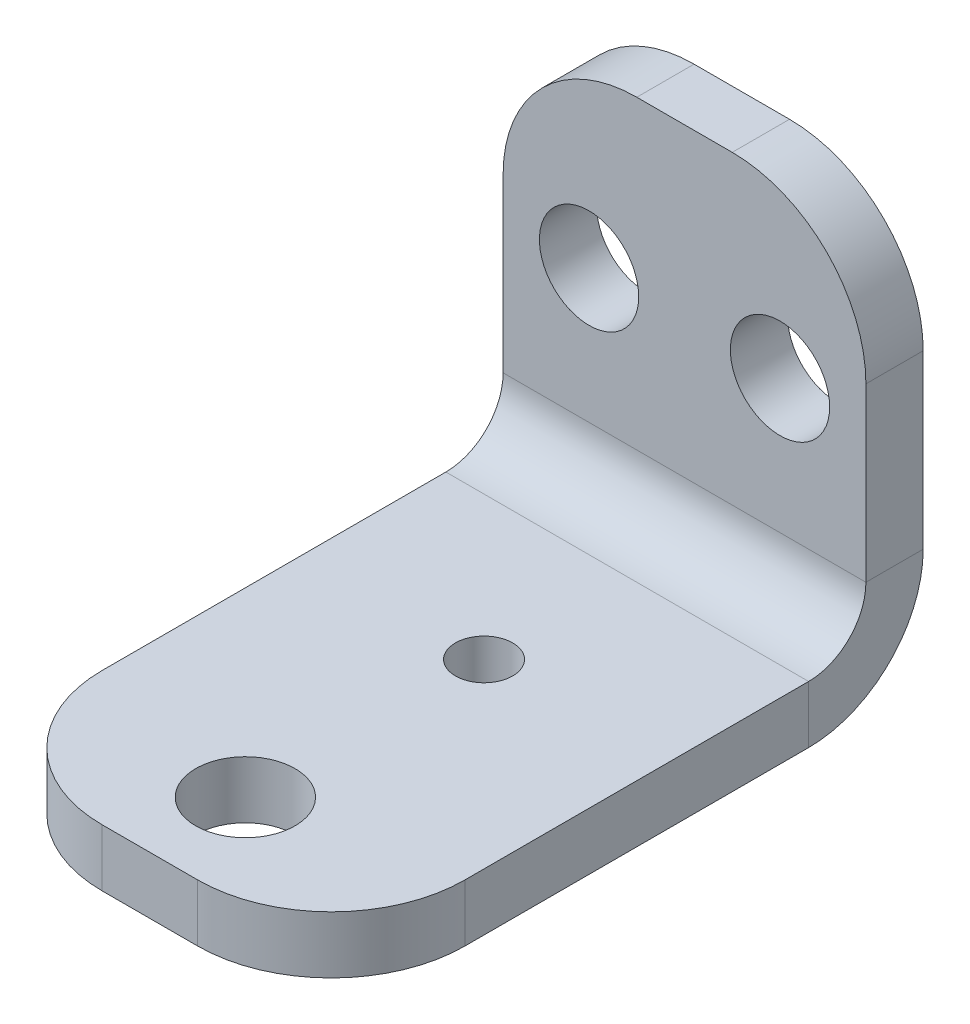
ISO-10303-21;
HEADER;
FILE_DESCRIPTION(('STEP AP214'),'2;1');
FILE_NAME('part.step','',(''),(''),'','','');
FILE_SCHEMA(('AUTOMOTIVE_DESIGN { 1 0 10303 214 1 1 1 1 }'));
ENDSEC;
DATA;
#1=APPLICATION_CONTEXT('core data for automotive mechanical design processes');
#2=APPLICATION_PROTOCOL_DEFINITION('international standard','automotive_design',2000,#1);
#3=PRODUCT_CONTEXT('',#1,'mechanical');
#4=PRODUCT('Part','Part','',(#3));
#5=PRODUCT_RELATED_PRODUCT_CATEGORY('part','',(#4));
#6=PRODUCT_DEFINITION_FORMATION('','',#4);
#7=PRODUCT_DEFINITION_CONTEXT('part definition',#1,'design');
#8=PRODUCT_DEFINITION('design','',#6,#7);
#9=PRODUCT_DEFINITION_SHAPE('','',#8);
#10=(LENGTH_UNIT() NAMED_UNIT(*) SI_UNIT(.MILLI.,.METRE.));
#11=(NAMED_UNIT(*) PLANE_ANGLE_UNIT() SI_UNIT($,.RADIAN.));
#12=(NAMED_UNIT(*) SI_UNIT($,.STERADIAN.) SOLID_ANGLE_UNIT());
#13=UNCERTAINTY_MEASURE_WITH_UNIT(LENGTH_MEASURE(1.E-05),#10,'distance_accuracy_value','');
#14=(GEOMETRIC_REPRESENTATION_CONTEXT(3) GLOBAL_UNCERTAINTY_ASSIGNED_CONTEXT((#13)) GLOBAL_UNIT_ASSIGNED_CONTEXT((#10,
#11,#12)) REPRESENTATION_CONTEXT('',''));
#15=CARTESIAN_POINT('',(0.,0.,0.));
#16=DIRECTION('',(0.,0.,1.));
#17=DIRECTION('',(1.,0.,0.));
#18=AXIS2_PLACEMENT_3D('',#15,#16,#17);
#19=CARTESIAN_POINT('',(9.5,-11.,-3.));
#20=DIRECTION('',(1.,0.,0.));
#21=DIRECTION('',(0.,0.,-1.));
#22=AXIS2_PLACEMENT_3D('',#19,#20,#21);
#23=PLANE('',#22);
#24=DIRECTION('',(0.,1.,0.));
#25=VECTOR('',#24,1.);
#26=CARTESIAN_POINT('',(9.5,-11.,-3.));
#27=LINE('',#26,#25);
#28=CARTESIAN_POINT('',(9.5,-5.00000000000001,-3.));
#29=VERTEX_POINT('',#28);
#30=CARTESIAN_POINT('',(9.5,4.,-3.));
#31=VERTEX_POINT('',#30);
#32=EDGE_CURVE('E213',#29,#31,#27,.T.);
#33=ORIENTED_EDGE('',*,*,#32,.T.);
#34=DIRECTION('',(0.,0.,1.));
#35=VECTOR('',#34,1.);
#36=CARTESIAN_POINT('',(9.5,4.,-3.));
#37=LINE('',#36,#35);
#38=CARTESIAN_POINT('',(9.5,4.,0.));
#39=VERTEX_POINT('',#38);
#40=EDGE_CURVE('E243',#31,#39,#37,.T.);
#41=ORIENTED_EDGE('',*,*,#40,.T.);
#42=DIRECTION('',(0.,1.,0.));
#43=VECTOR('',#42,1.);
#44=CARTESIAN_POINT('',(9.5,-11.,0.));
#45=LINE('',#44,#43);
#46=CARTESIAN_POINT('',(9.5,-5.00000000000001,0.));
#47=VERTEX_POINT('',#46);
#48=EDGE_CURVE('E211',#47,#39,#45,.T.);
#49=ORIENTED_EDGE('',*,*,#48,.F.);
#50=DIRECTION('',(0.,0.,-1.));
#51=VECTOR('',#50,1.);
#52=CARTESIAN_POINT('',(9.5,-5.00000000000001,0.));
#53=LINE('',#52,#51);
#54=EDGE_CURVE('E200',#47,#29,#53,.T.);
#55=ORIENTED_EDGE('',*,*,#54,.T.);
#56=EDGE_LOOP('',(#33,#41,#49,#55));
#57=FACE_BOUND('',#56,.T.);
#58=ADVANCED_FACE('F60',(#57),#23,.T.);
#59=CARTESIAN_POINT('',(0.,0.,-3.));
#60=DIRECTION('',(0.,0.,-1.));
#61=DIRECTION('',(-1.,0.,0.));
#62=AXIS2_PLACEMENT_3D('',#59,#60,#61);
#63=PLANE('',#62);
#64=CARTESIAN_POINT('',(5.,1.99999999999999,-3.));
#65=DIRECTION('',(0.,0.,-1.));
#66=DIRECTION('',(-1.,0.,0.));
#67=AXIS2_PLACEMENT_3D('',#64,#65,#66);
#68=CIRCLE('',#67,2.6);
#69=CARTESIAN_POINT('',(2.4,1.99999999999999,-3.));
#70=VERTEX_POINT('',#69);
#71=EDGE_CURVE('E197',#70,#70,#68,.T.);
#72=ORIENTED_EDGE('',*,*,#71,.F.);
#73=EDGE_LOOP('',(#72));
#74=FACE_BOUND('',#73,.T.);
#75=CARTESIAN_POINT('',(-5.,1.99999999999999,-3.));
#76=DIRECTION('',(0.,0.,-1.));
#77=DIRECTION('',(-1.,0.,0.));
#78=AXIS2_PLACEMENT_3D('',#75,#76,#77);
#79=CIRCLE('',#78,2.6);
#80=CARTESIAN_POINT('',(-7.6,1.99999999999999,-3.));
#81=VERTEX_POINT('',#80);
#82=EDGE_CURVE('E539',#81,#81,#79,.T.);
#83=ORIENTED_EDGE('',*,*,#82,.F.);
#84=EDGE_LOOP('',(#83));
#85=FACE_BOUND('',#84,.T.);
#86=DIRECTION('',(0.,-1.,0.));
#87=VECTOR('',#86,1.);
#88=CARTESIAN_POINT('',(-9.5,-11.,-3.));
#89=LINE('',#88,#87);
#90=CARTESIAN_POINT('',(-9.5,4.,-3.));
#91=VERTEX_POINT('',#90);
#92=CARTESIAN_POINT('',(-9.5,-4.99999999999999,-3.));
#93=VERTEX_POINT('',#92);
#94=EDGE_CURVE('E220',#91,#93,#89,.T.);
#95=ORIENTED_EDGE('',*,*,#94,.F.);
#96=CARTESIAN_POINT('',(-2.5,4.,-3.));
#97=DIRECTION('',(0.,0.,-1.));
#98=DIRECTION('',(-1.,0.,0.));
#99=AXIS2_PLACEMENT_3D('',#96,#97,#98);
#100=CIRCLE('',#99,7.);
#101=CARTESIAN_POINT('',(-2.5,11.,-3.));
#102=VERTEX_POINT('',#101);
#103=EDGE_CURVE('E241',#91,#102,#100,.T.);
#104=ORIENTED_EDGE('',*,*,#103,.T.);
#105=DIRECTION('',(-1.,0.,0.));
#106=VECTOR('',#105,1.);
#107=CARTESIAN_POINT('',(-9.5,11.,-3.));
#108=LINE('',#107,#106);
#109=CARTESIAN_POINT('',(2.5,11.,-3.));
#110=VERTEX_POINT('',#109);
#111=EDGE_CURVE('E216',#110,#102,#108,.T.);
#112=ORIENTED_EDGE('',*,*,#111,.F.);
#113=CARTESIAN_POINT('',(2.5,4.,-3.));
#114=DIRECTION('',(0.,0.,-1.));
#115=DIRECTION('',(-1.,0.,0.));
#116=AXIS2_PLACEMENT_3D('',#113,#114,#115);
#117=CIRCLE('',#116,7.);
#118=EDGE_CURVE('E239',#110,#31,#117,.T.);
#119=ORIENTED_EDGE('',*,*,#118,.T.);
#120=ORIENTED_EDGE('',*,*,#32,.F.);
#121=DIRECTION('',(1.,0.,0.));
#122=VECTOR('',#121,1.);
#123=CARTESIAN_POINT('',(9.5,-5.00000000000001,-3.));
#124=LINE('',#123,#122);
#125=EDGE_CURVE('E160',#29,#93,#124,.F.);
#126=ORIENTED_EDGE('',*,*,#125,.T.);
#127=EDGE_LOOP('',(#95,#104,#112,#119,#120,#126));
#128=FACE_BOUND('',#127,.T.);
#129=ADVANCED_FACE('F287',(#74,#85,#128),#63,.T.);
#130=CARTESIAN_POINT('',(0.,0.,0.));
#131=DIRECTION('',(0.,0.,-1.));
#132=DIRECTION('',(-1.,0.,0.));
#133=AXIS2_PLACEMENT_3D('',#130,#131,#132);
#134=PLANE('',#133);
#135=CARTESIAN_POINT('',(5.,1.99999999999999,0.));
#136=DIRECTION('',(0.,0.,1.));
#137=DIRECTION('',(1.,0.,0.));
#138=AXIS2_PLACEMENT_3D('',#135,#136,#137);
#139=CIRCLE('',#138,2.6);
#140=CARTESIAN_POINT('',(7.6,1.99999999999999,0.));
#141=VERTEX_POINT('',#140);
#142=EDGE_CURVE('E532',#141,#141,#139,.T.);
#143=ORIENTED_EDGE('',*,*,#142,.F.);
#144=EDGE_LOOP('',(#143));
#145=FACE_BOUND('',#144,.T.);
#146=CARTESIAN_POINT('',(-5.,1.99999999999999,0.));
#147=DIRECTION('',(0.,0.,1.));
#148=DIRECTION('',(1.,0.,0.));
#149=AXIS2_PLACEMENT_3D('',#146,#147,#148);
#150=CIRCLE('',#149,2.6);
#151=CARTESIAN_POINT('',(-2.4,1.99999999999999,0.));
#152=VERTEX_POINT('',#151);
#153=EDGE_CURVE('E535',#152,#152,#150,.T.);
#154=ORIENTED_EDGE('',*,*,#153,.F.);
#155=EDGE_LOOP('',(#154));
#156=FACE_BOUND('',#155,.T.);
#157=DIRECTION('',(-1.,0.,0.));
#158=VECTOR('',#157,1.);
#159=CARTESIAN_POINT('',(-9.5,11.,0.));
#160=LINE('',#159,#158);
#161=CARTESIAN_POINT('',(2.5,11.,0.));
#162=VERTEX_POINT('',#161);
#163=CARTESIAN_POINT('',(-2.5,11.,0.));
#164=VERTEX_POINT('',#163);
#165=EDGE_CURVE('E225',#162,#164,#160,.T.);
#166=ORIENTED_EDGE('',*,*,#165,.T.);
#167=CARTESIAN_POINT('',(-2.5,4.,0.));
#168=DIRECTION('',(0.,0.,-1.));
#169=DIRECTION('',(-1.,0.,0.));
#170=AXIS2_PLACEMENT_3D('',#167,#168,#169);
#171=CIRCLE('',#170,7.);
#172=CARTESIAN_POINT('',(-9.5,4.,0.));
#173=VERTEX_POINT('',#172);
#174=EDGE_CURVE('E235',#164,#173,#171,.F.);
#175=ORIENTED_EDGE('',*,*,#174,.T.);
#176=DIRECTION('',(0.,-1.,0.));
#177=VECTOR('',#176,1.);
#178=CARTESIAN_POINT('',(-9.5,-11.,0.));
#179=LINE('',#178,#177);
#180=CARTESIAN_POINT('',(-9.5,-5.00000000000001,0.));
#181=VERTEX_POINT('',#180);
#182=EDGE_CURVE('E217',#173,#181,#179,.T.);
#183=ORIENTED_EDGE('',*,*,#182,.T.);
#184=DIRECTION('',(1.,0.,0.));
#185=VECTOR('',#184,1.);
#186=CARTESIAN_POINT('',(9.5,-5.00000000000001,0.));
#187=LINE('',#186,#185);
#188=EDGE_CURVE('E204',#47,#181,#187,.F.);
#189=ORIENTED_EDGE('',*,*,#188,.F.);
#190=ORIENTED_EDGE('',*,*,#48,.T.);
#191=CARTESIAN_POINT('',(2.5,4.,0.));
#192=DIRECTION('',(0.,0.,-1.));
#193=DIRECTION('',(-1.,0.,0.));
#194=AXIS2_PLACEMENT_3D('',#191,#192,#193);
#195=CIRCLE('',#194,7.);
#196=EDGE_CURVE('E233',#39,#162,#195,.F.);
#197=ORIENTED_EDGE('',*,*,#196,.T.);
#198=EDGE_LOOP('',(#166,#175,#183,#189,#190,#197));
#199=FACE_BOUND('',#198,.T.);
#200=ADVANCED_FACE('F298',(#145,#156,#199),#134,.F.);
#201=CARTESIAN_POINT('',(-9.5,-11.,-3.));
#202=DIRECTION('',(-1.,0.,0.));
#203=DIRECTION('',(0.,0.,1.));
#204=AXIS2_PLACEMENT_3D('',#201,#202,#203);
#205=PLANE('',#204);
#206=ORIENTED_EDGE('',*,*,#182,.F.);
#207=DIRECTION('',(0.,0.,1.));
#208=VECTOR('',#207,1.);
#209=CARTESIAN_POINT('',(-9.5,4.,-3.));
#210=LINE('',#209,#208);
#211=EDGE_CURVE('E237',#173,#91,#210,.F.);
#212=ORIENTED_EDGE('',*,*,#211,.T.);
#213=ORIENTED_EDGE('',*,*,#94,.T.);
#214=DIRECTION('',(0.,0.,-1.));
#215=VECTOR('',#214,1.);
#216=CARTESIAN_POINT('',(-9.5,-5.00000000000001,0.));
#217=LINE('',#216,#215);
#218=EDGE_CURVE('E208',#181,#93,#217,.T.);
#219=ORIENTED_EDGE('',*,*,#218,.F.);
#220=EDGE_LOOP('',(#206,#212,#213,#219));
#221=FACE_BOUND('',#220,.T.);
#222=ADVANCED_FACE('F282',(#221),#205,.T.);
#223=CARTESIAN_POINT('',(-9.5,11.,-3.));
#224=DIRECTION('',(0.,1.,0.));
#225=DIRECTION('',(0.,0.,1.));
#226=AXIS2_PLACEMENT_3D('',#223,#224,#225);
#227=PLANE('',#226);
#228=ORIENTED_EDGE('',*,*,#111,.T.);
#229=DIRECTION('',(0.,0.,1.));
#230=VECTOR('',#229,1.);
#231=CARTESIAN_POINT('',(-2.5,11.,-3.));
#232=LINE('',#231,#230);
#233=EDGE_CURVE('E230',#102,#164,#232,.T.);
#234=ORIENTED_EDGE('',*,*,#233,.T.);
#235=ORIENTED_EDGE('',*,*,#165,.F.);
#236=DIRECTION('',(0.,0.,1.));
#237=VECTOR('',#236,1.);
#238=CARTESIAN_POINT('',(2.5,11.,-3.));
#239=LINE('',#238,#237);
#240=EDGE_CURVE('E222',#162,#110,#239,.F.);
#241=ORIENTED_EDGE('',*,*,#240,.T.);
#242=EDGE_LOOP('',(#228,#234,#235,#241));
#243=FACE_BOUND('',#242,.T.);
#244=ADVANCED_FACE('F295',(#243),#227,.T.);
#245=CARTESIAN_POINT('',(-9.5,-5.00000000000001,3.));
#246=DIRECTION('',(-1.,0.,0.));
#247=DIRECTION('',(0.,0.,1.));
#248=AXIS2_PLACEMENT_3D('',#245,#246,#247);
#249=PLANE('',#248);
#250=DIRECTION('',(0.,1.,0.));
#251=VECTOR('',#250,1.);
#252=CARTESIAN_POINT('',(-9.5,-11.,2.99999999999998));
#253=LINE('',#252,#251);
#254=CARTESIAN_POINT('',(-9.5,-8.00000000000001,2.99999999999999));
#255=VERTEX_POINT('',#254);
#256=CARTESIAN_POINT('',(-9.5,-11.,2.99999999999998));
#257=VERTEX_POINT('',#256);
#258=EDGE_CURVE('E194',#255,#257,#253,.F.);
#259=ORIENTED_EDGE('',*,*,#258,.F.);
#260=CARTESIAN_POINT('',(-9.5,-5.00000000000001,3.));
#261=DIRECTION('',(1.,0.,0.));
#262=DIRECTION('',(0.,0.,-1.));
#263=AXIS2_PLACEMENT_3D('',#260,#261,#262);
#264=CIRCLE('',#263,3.);
#265=EDGE_CURVE('E163',#181,#255,#264,.F.);
#266=ORIENTED_EDGE('',*,*,#265,.F.);
#267=ORIENTED_EDGE('',*,*,#218,.T.);
#268=CARTESIAN_POINT('',(-9.5,-5.00000000000001,3.));
#269=DIRECTION('',(1.,0.,0.));
#270=DIRECTION('',(0.,0.,-1.));
#271=AXIS2_PLACEMENT_3D('',#268,#269,#270);
#272=CIRCLE('',#271,6.);
#273=EDGE_CURVE('E199',#93,#257,#272,.F.);
#274=ORIENTED_EDGE('',*,*,#273,.T.);
#275=EDGE_LOOP('',(#259,#266,#267,#274));
#276=FACE_BOUND('',#275,.T.);
#277=ADVANCED_FACE('F279',(#276),#249,.T.);
#278=CARTESIAN_POINT('',(9.5,-5.00000000000001,3.));
#279=DIRECTION('',(-1.,0.,0.));
#280=DIRECTION('',(0.,0.,1.));
#281=AXIS2_PLACEMENT_3D('',#278,#279,#280);
#282=PLANE('',#281);
#283=CARTESIAN_POINT('',(9.5,-5.00000000000001,3.));
#284=DIRECTION('',(1.,0.,0.));
#285=DIRECTION('',(0.,0.,-1.));
#286=AXIS2_PLACEMENT_3D('',#283,#284,#285);
#287=CIRCLE('',#286,3.);
#288=CARTESIAN_POINT('',(9.5,-8.00000000000001,2.99999999999999));
#289=VERTEX_POINT('',#288);
#290=EDGE_CURVE('E170',#289,#47,#287,.T.);
#291=ORIENTED_EDGE('',*,*,#290,.F.);
#292=DIRECTION('',(0.,1.,0.));
#293=VECTOR('',#292,1.);
#294=CARTESIAN_POINT('',(9.5,-8.00000000000001,2.99999999999999));
#295=LINE('',#294,#293);
#296=CARTESIAN_POINT('',(9.5,-11.,2.99999999999998));
#297=VERTEX_POINT('',#296);
#298=EDGE_CURVE('E167',#289,#297,#295,.F.);
#299=ORIENTED_EDGE('',*,*,#298,.T.);
#300=CARTESIAN_POINT('',(9.5,-5.00000000000001,3.));
#301=DIRECTION('',(1.,0.,0.));
#302=DIRECTION('',(0.,0.,-1.));
#303=AXIS2_PLACEMENT_3D('',#300,#301,#302);
#304=CIRCLE('',#303,6.);
#305=EDGE_CURVE('E152',#297,#29,#304,.T.);
#306=ORIENTED_EDGE('',*,*,#305,.T.);
#307=ORIENTED_EDGE('',*,*,#54,.F.);
#308=EDGE_LOOP('',(#291,#299,#306,#307));
#309=FACE_BOUND('',#308,.T.);
#310=ADVANCED_FACE('F168',(#309),#282,.F.);
#311=CARTESIAN_POINT('',(9.5,-5.00000000000001,3.));
#312=DIRECTION('',(1.,0.,0.));
#313=DIRECTION('',(0.,-1.,0.));
#314=AXIS2_PLACEMENT_3D('',#311,#312,#313);
#315=CYLINDRICAL_SURFACE('',#314,6.);
#316=ORIENTED_EDGE('',*,*,#125,.F.);
#317=ORIENTED_EDGE('',*,*,#305,.F.);
#318=DIRECTION('',(1.,0.,0.));
#319=VECTOR('',#318,1.);
#320=CARTESIAN_POINT('',(-9.5,-11.,2.99999999999998));
#321=LINE('',#320,#319);
#322=EDGE_CURVE('E157',#297,#257,#321,.F.);
#323=ORIENTED_EDGE('',*,*,#322,.T.);
#324=ORIENTED_EDGE('',*,*,#273,.F.);
#325=EDGE_LOOP('',(#316,#317,#323,#324));
#326=FACE_BOUND('',#325,.T.);
#327=ADVANCED_FACE('F154',(#326),#315,.T.);
#328=CARTESIAN_POINT('',(9.5,-5.00000000000001,3.));
#329=DIRECTION('',(1.,0.,0.));
#330=DIRECTION('',(0.,-1.,0.));
#331=AXIS2_PLACEMENT_3D('',#328,#329,#330);
#332=CYLINDRICAL_SURFACE('',#331,3.);
#333=ORIENTED_EDGE('',*,*,#188,.T.);
#334=ORIENTED_EDGE('',*,*,#265,.T.);
#335=DIRECTION('',(1.,0.,0.));
#336=VECTOR('',#335,1.);
#337=CARTESIAN_POINT('',(-9.5,-8.00000000000001,2.99999999999999));
#338=LINE('',#337,#336);
#339=EDGE_CURVE('E172',#255,#289,#338,.T.);
#340=ORIENTED_EDGE('',*,*,#339,.T.);
#341=ORIENTED_EDGE('',*,*,#290,.T.);
#342=EDGE_LOOP('',(#333,#334,#340,#341));
#343=FACE_BOUND('',#342,.T.);
#344=ADVANCED_FACE('F274',(#343),#332,.F.);
#345=CARTESIAN_POINT('',(-9.5,-11.,0.));
#346=DIRECTION('',(1.,0.,0.));
#347=DIRECTION('',(0.,0.,-1.));
#348=AXIS2_PLACEMENT_3D('',#345,#346,#347);
#349=PLANE('',#348);
#350=DIRECTION('',(0.,0.,-1.));
#351=VECTOR('',#350,1.);
#352=CARTESIAN_POINT('',(-9.5,-11.,0.));
#353=LINE('',#352,#351);
#354=CARTESIAN_POINT('',(-9.5,-11.0000000000001,21.));
#355=VERTEX_POINT('',#354);
#356=EDGE_CURVE('E177',#355,#257,#353,.T.);
#357=ORIENTED_EDGE('',*,*,#356,.F.);
#358=DIRECTION('',(0.,1.,0.));
#359=VECTOR('',#358,1.);
#360=CARTESIAN_POINT('',(-9.5,-11.0000000000001,21.));
#361=LINE('',#360,#359);
#362=CARTESIAN_POINT('',(-9.5,-8.00000000000007,21.));
#363=VERTEX_POINT('',#362);
#364=EDGE_CURVE('E13',#355,#363,#361,.T.);
#365=ORIENTED_EDGE('',*,*,#364,.T.);
#366=DIRECTION('',(0.,0.,1.));
#367=VECTOR('',#366,1.);
#368=CARTESIAN_POINT('',(-9.5,-8.,0.));
#369=LINE('',#368,#367);
#370=EDGE_CURVE('E178',#363,#255,#369,.F.);
#371=ORIENTED_EDGE('',*,*,#370,.T.);
#372=ORIENTED_EDGE('',*,*,#258,.T.);
#373=EDGE_LOOP('',(#357,#365,#371,#372));
#374=FACE_BOUND('',#373,.T.);
#375=ADVANCED_FACE('F271',(#374),#349,.F.);
#376=CARTESIAN_POINT('',(9.5,-11.0000000000001,28.));
#377=DIRECTION('',(-1.,0.,0.));
#378=DIRECTION('',(0.,0.,1.));
#379=AXIS2_PLACEMENT_3D('',#376,#377,#378);
#380=PLANE('',#379);
#381=DIRECTION('',(0.,0.,-1.));
#382=VECTOR('',#381,1.);
#383=CARTESIAN_POINT('',(9.5,-8.00000000000009,28.));
#384=LINE('',#383,#382);
#385=CARTESIAN_POINT('',(9.5,-8.00000000000007,21.));
#386=VERTEX_POINT('',#385);
#387=EDGE_CURVE('E190',#289,#386,#384,.F.);
#388=ORIENTED_EDGE('',*,*,#387,.T.);
#389=DIRECTION('',(0.,1.,0.));
#390=VECTOR('',#389,1.);
#391=CARTESIAN_POINT('',(9.5,-11.0000000000001,21.));
#392=LINE('',#391,#390);
#393=CARTESIAN_POINT('',(9.5,-11.0000000000001,21.));
#394=VERTEX_POINT('',#393);
#395=EDGE_CURVE('E83',#386,#394,#392,.F.);
#396=ORIENTED_EDGE('',*,*,#395,.T.);
#397=DIRECTION('',(0.,0.,1.));
#398=VECTOR('',#397,1.);
#399=CARTESIAN_POINT('',(9.5,-11.,0.));
#400=LINE('',#399,#398);
#401=EDGE_CURVE('E175',#297,#394,#400,.T.);
#402=ORIENTED_EDGE('',*,*,#401,.F.);
#403=ORIENTED_EDGE('',*,*,#298,.F.);
#404=EDGE_LOOP('',(#388,#396,#402,#403));
#405=FACE_BOUND('',#404,.T.);
#406=ADVANCED_FACE('F180',(#405),#380,.F.);
#407=CARTESIAN_POINT('',(0.,-11.,0.));
#408=DIRECTION('',(0.,1.,0.));
#409=DIRECTION('',(0.,0.,1.));
#410=AXIS2_PLACEMENT_3D('',#407,#408,#409);
#411=PLANE('',#410);
#412=CARTESIAN_POINT('',(0.,-11.0000000000002,10.4999999999999));
#413=DIRECTION('',(0.,1.,0.));
#414=DIRECTION('',(0.,0.,1.));
#415=AXIS2_PLACEMENT_3D('',#412,#413,#414);
#416=CIRCLE('',#415,1.5);
#417=CARTESIAN_POINT('',(0.,-11.0000000000002,11.9999999999999));
#418=VERTEX_POINT('',#417);
#419=EDGE_CURVE('E553',#418,#418,#416,.T.);
#420=ORIENTED_EDGE('',*,*,#419,.T.);
#421=EDGE_LOOP('',(#420));
#422=FACE_BOUND('',#421,.T.);
#423=CARTESIAN_POINT('',(0.,-11.0000000000002,23.));
#424=DIRECTION('',(0.,1.,0.));
#425=DIRECTION('',(0.,0.,1.));
#426=AXIS2_PLACEMENT_3D('',#423,#424,#425);
#427=CIRCLE('',#426,2.6);
#428=CARTESIAN_POINT('',(0.,-11.0000000000002,25.6));
#429=VERTEX_POINT('',#428);
#430=EDGE_CURVE('E537',#429,#429,#427,.T.);
#431=ORIENTED_EDGE('',*,*,#430,.T.);
#432=EDGE_LOOP('',(#431));
#433=FACE_BOUND('',#432,.T.);
#434=ORIENTED_EDGE('',*,*,#401,.T.);
#435=CARTESIAN_POINT('',(2.5,-11.0000000000001,21.));
#436=DIRECTION('',(0.,1.,0.));
#437=DIRECTION('',(0.,0.,1.));
#438=AXIS2_PLACEMENT_3D('',#435,#436,#437);
#439=CIRCLE('',#438,7.);
#440=CARTESIAN_POINT('',(2.5,-11.0000000000001,28.));
#441=VERTEX_POINT('',#440);
#442=EDGE_CURVE('E68',#394,#441,#439,.F.);
#443=ORIENTED_EDGE('',*,*,#442,.T.);
#444=DIRECTION('',(-1.,0.,0.));
#445=VECTOR('',#444,1.);
#446=CARTESIAN_POINT('',(0.,-11.0000000000001,28.));
#447=LINE('',#446,#445);
#448=CARTESIAN_POINT('',(-2.5,-11.0000000000001,28.));
#449=VERTEX_POINT('',#448);
#450=EDGE_CURVE('E181',#441,#449,#447,.T.);
#451=ORIENTED_EDGE('',*,*,#450,.T.);
#452=CARTESIAN_POINT('',(-2.5,-11.0000000000001,21.));
#453=DIRECTION('',(0.,1.,0.));
#454=DIRECTION('',(0.,0.,1.));
#455=AXIS2_PLACEMENT_3D('',#452,#453,#454);
#456=CIRCLE('',#455,7.);
#457=EDGE_CURVE('E75',#449,#355,#456,.F.);
#458=ORIENTED_EDGE('',*,*,#457,.T.);
#459=ORIENTED_EDGE('',*,*,#356,.T.);
#460=ORIENTED_EDGE('',*,*,#322,.F.);
#461=EDGE_LOOP('',(#434,#443,#451,#458,#459,#460));
#462=FACE_BOUND('',#461,.T.);
#463=ADVANCED_FACE('F174',(#422,#433,#462),#411,.F.);
#464=CARTESIAN_POINT('',(0.,-8.,0.));
#465=DIRECTION('',(0.,1.,0.));
#466=DIRECTION('',(0.,0.,1.));
#467=AXIS2_PLACEMENT_3D('',#464,#465,#466);
#468=PLANE('',#467);
#469=CARTESIAN_POINT('',(0.,-8.00000000000003,10.5));
#470=DIRECTION('',(0.,1.,0.));
#471=DIRECTION('',(0.,0.,1.));
#472=AXIS2_PLACEMENT_3D('',#469,#470,#471);
#473=CIRCLE('',#472,1.5);
#474=CARTESIAN_POINT('',(0.,-8.00000000000004,12.));
#475=VERTEX_POINT('',#474);
#476=EDGE_CURVE('E555',#475,#475,#473,.T.);
#477=ORIENTED_EDGE('',*,*,#476,.F.);
#478=EDGE_LOOP('',(#477));
#479=FACE_BOUND('',#478,.T.);
#480=CARTESIAN_POINT('',(0.,-8.00000000000008,23.));
#481=DIRECTION('',(0.,1.,0.));
#482=DIRECTION('',(0.,0.,1.));
#483=AXIS2_PLACEMENT_3D('',#480,#481,#482);
#484=CIRCLE('',#483,2.6);
#485=CARTESIAN_POINT('',(0.,-8.00000000000009,25.6));
#486=VERTEX_POINT('',#485);
#487=EDGE_CURVE('E542',#486,#486,#484,.T.);
#488=ORIENTED_EDGE('',*,*,#487,.F.);
#489=EDGE_LOOP('',(#488));
#490=FACE_BOUND('',#489,.T.);
#491=DIRECTION('',(1.,0.,0.));
#492=VECTOR('',#491,1.);
#493=CARTESIAN_POINT('',(-9.5,-8.00000000000009,28.));
#494=LINE('',#493,#492);
#495=CARTESIAN_POINT('',(2.5,-8.00000000000009,28.));
#496=VERTEX_POINT('',#495);
#497=CARTESIAN_POINT('',(-2.5,-8.00000000000009,28.));
#498=VERTEX_POINT('',#497);
#499=EDGE_CURVE('E184',#496,#498,#494,.F.);
#500=ORIENTED_EDGE('',*,*,#499,.F.);
#501=CARTESIAN_POINT('',(2.5,-8.00000000000007,21.));
#502=DIRECTION('',(0.,1.,0.));
#503=DIRECTION('',(0.,0.,1.));
#504=AXIS2_PLACEMENT_3D('',#501,#502,#503);
#505=CIRCLE('',#504,7.);
#506=EDGE_CURVE('E253',#496,#386,#505,.T.);
#507=ORIENTED_EDGE('',*,*,#506,.T.);
#508=ORIENTED_EDGE('',*,*,#387,.F.);
#509=ORIENTED_EDGE('',*,*,#339,.F.);
#510=ORIENTED_EDGE('',*,*,#370,.F.);
#511=CARTESIAN_POINT('',(-2.5,-8.00000000000007,21.));
#512=DIRECTION('',(0.,1.,0.));
#513=DIRECTION('',(0.,0.,1.));
#514=AXIS2_PLACEMENT_3D('',#511,#512,#513);
#515=CIRCLE('',#514,7.);
#516=EDGE_CURVE('E251',#363,#498,#515,.T.);
#517=ORIENTED_EDGE('',*,*,#516,.T.);
#518=EDGE_LOOP('',(#500,#507,#508,#509,#510,#517));
#519=FACE_BOUND('',#518,.T.);
#520=ADVANCED_FACE('F265',(#479,#490,#519),#468,.T.);
#521=CARTESIAN_POINT('',(-9.5,-11.0000000000001,28.));
#522=DIRECTION('',(0.,0.,-1.));
#523=DIRECTION('',(0.,1.,0.));
#524=AXIS2_PLACEMENT_3D('',#521,#522,#523);
#525=PLANE('',#524);
#526=ORIENTED_EDGE('',*,*,#450,.F.);
#527=DIRECTION('',(0.,1.,0.));
#528=VECTOR('',#527,1.);
#529=CARTESIAN_POINT('',(2.5,-11.0000000000001,28.));
#530=LINE('',#529,#528);
#531=EDGE_CURVE('E248',#441,#496,#530,.T.);
#532=ORIENTED_EDGE('',*,*,#531,.T.);
#533=ORIENTED_EDGE('',*,*,#499,.T.);
#534=DIRECTION('',(0.,1.,0.));
#535=VECTOR('',#534,1.);
#536=CARTESIAN_POINT('',(-2.5,-11.0000000000001,28.));
#537=LINE('',#536,#535);
#538=EDGE_CURVE('E246',#498,#449,#537,.F.);
#539=ORIENTED_EDGE('',*,*,#538,.T.);
#540=EDGE_LOOP('',(#526,#532,#533,#539));
#541=FACE_BOUND('',#540,.T.);
#542=ADVANCED_FACE('F260',(#541),#525,.F.);
#543=CARTESIAN_POINT('',(-5.,1.99999999999999,-10.));
#544=DIRECTION('',(0.,0.,1.));
#545=DIRECTION('',(1.,0.,0.));
#546=AXIS2_PLACEMENT_3D('',#543,#544,#545);
#547=CYLINDRICAL_SURFACE('',#546,2.6);
#548=ORIENTED_EDGE('',*,*,#82,.T.);
#549=EDGE_LOOP('',(#548));
#550=FACE_BOUND('',#549,.T.);
#551=ORIENTED_EDGE('',*,*,#153,.T.);
#552=EDGE_LOOP('',(#551));
#553=FACE_BOUND('',#552,.T.);
#554=ADVANCED_FACE('F340',(#550,#553),#547,.F.);
#555=CARTESIAN_POINT('',(5.,1.99999999999999,-10.));
#556=DIRECTION('',(0.,0.,1.));
#557=DIRECTION('',(1.,0.,0.));
#558=AXIS2_PLACEMENT_3D('',#555,#556,#557);
#559=CYLINDRICAL_SURFACE('',#558,2.6);
#560=ORIENTED_EDGE('',*,*,#71,.T.);
#561=EDGE_LOOP('',(#560));
#562=FACE_BOUND('',#561,.T.);
#563=ORIENTED_EDGE('',*,*,#142,.T.);
#564=EDGE_LOOP('',(#563));
#565=FACE_BOUND('',#564,.T.);
#566=ADVANCED_FACE('F336',(#562,#565),#559,.F.);
#567=CARTESIAN_POINT('',(0.,-11.0000000000002,23.));
#568=DIRECTION('',(0.,1.,0.));
#569=DIRECTION('',(0.,0.,1.));
#570=AXIS2_PLACEMENT_3D('',#567,#568,#569);
#571=CYLINDRICAL_SURFACE('',#570,2.6);
#572=ORIENTED_EDGE('',*,*,#430,.F.);
#573=EDGE_LOOP('',(#572));
#574=FACE_BOUND('',#573,.T.);
#575=ORIENTED_EDGE('',*,*,#487,.T.);
#576=EDGE_LOOP('',(#575));
#577=FACE_BOUND('',#576,.T.);
#578=ADVANCED_FACE('F317',(#574,#577),#571,.F.);
#579=CARTESIAN_POINT('',(-2.5,4.,-3.));
#580=DIRECTION('',(0.,0.,1.));
#581=DIRECTION('',(1.,0.,0.));
#582=AXIS2_PLACEMENT_3D('',#579,#580,#581);
#583=CYLINDRICAL_SURFACE('',#582,7.);
#584=ORIENTED_EDGE('',*,*,#103,.F.);
#585=ORIENTED_EDGE('',*,*,#211,.F.);
#586=ORIENTED_EDGE('',*,*,#174,.F.);
#587=ORIENTED_EDGE('',*,*,#233,.F.);
#588=EDGE_LOOP('',(#584,#585,#586,#587));
#589=FACE_BOUND('',#588,.T.);
#590=ADVANCED_FACE('F292',(#589),#583,.T.);
#591=CARTESIAN_POINT('',(2.5,4.,-3.));
#592=DIRECTION('',(0.,0.,1.));
#593=DIRECTION('',(1.,0.,0.));
#594=AXIS2_PLACEMENT_3D('',#591,#592,#593);
#595=CYLINDRICAL_SURFACE('',#594,7.);
#596=ORIENTED_EDGE('',*,*,#118,.F.);
#597=ORIENTED_EDGE('',*,*,#240,.F.);
#598=ORIENTED_EDGE('',*,*,#196,.F.);
#599=ORIENTED_EDGE('',*,*,#40,.F.);
#600=EDGE_LOOP('',(#596,#597,#598,#599));
#601=FACE_BOUND('',#600,.T.);
#602=ADVANCED_FACE('F303',(#601),#595,.T.);
#603=CARTESIAN_POINT('',(2.5,-11.0000000000001,21.));
#604=DIRECTION('',(0.,1.,0.));
#605=DIRECTION('',(0.,0.,1.));
#606=AXIS2_PLACEMENT_3D('',#603,#604,#605);
#607=CYLINDRICAL_SURFACE('',#606,7.);
#608=ORIENTED_EDGE('',*,*,#442,.F.);
#609=ORIENTED_EDGE('',*,*,#395,.F.);
#610=ORIENTED_EDGE('',*,*,#506,.F.);
#611=ORIENTED_EDGE('',*,*,#531,.F.);
#612=EDGE_LOOP('',(#608,#609,#610,#611));
#613=FACE_BOUND('',#612,.T.);
#614=ADVANCED_FACE('F263',(#613),#607,.T.);
#615=CARTESIAN_POINT('',(-2.5,-11.0000000000001,21.));
#616=DIRECTION('',(0.,1.,0.));
#617=DIRECTION('',(0.,0.,1.));
#618=AXIS2_PLACEMENT_3D('',#615,#616,#617);
#619=CYLINDRICAL_SURFACE('',#618,7.);
#620=ORIENTED_EDGE('',*,*,#457,.F.);
#621=ORIENTED_EDGE('',*,*,#538,.F.);
#622=ORIENTED_EDGE('',*,*,#516,.F.);
#623=ORIENTED_EDGE('',*,*,#364,.F.);
#624=EDGE_LOOP('',(#620,#621,#622,#623));
#625=FACE_BOUND('',#624,.T.);
#626=ADVANCED_FACE('F62',(#625),#619,.T.);
#627=CARTESIAN_POINT('',(0.,-11.0000000000002,10.4999999999999));
#628=DIRECTION('',(0.,1.,0.));
#629=DIRECTION('',(0.,0.,1.));
#630=AXIS2_PLACEMENT_3D('',#627,#628,#629);
#631=CYLINDRICAL_SURFACE('',#630,1.5);
#632=ORIENTED_EDGE('',*,*,#419,.F.);
#633=EDGE_LOOP('',(#632));
#634=FACE_BOUND('',#633,.T.);
#635=ORIENTED_EDGE('',*,*,#476,.T.);
#636=EDGE_LOOP('',(#635));
#637=FACE_BOUND('',#636,.T.);
#638=ADVANCED_FACE('F323',(#634,#637),#631,.F.);
#639=CLOSED_SHELL('',(#58,#129,#200,#222,#244,#277,#310,#327,#344,#375,#406,#463,#520,#542,#554,
#566,#578,#590,#602,#614,#626,#638));
#640=MANIFOLD_SOLID_BREP('B2',#639);
#641=ADVANCED_BREP_SHAPE_REPRESENTATION('',(#18,#640),#14);
#642=SHAPE_DEFINITION_REPRESENTATION(#9,#641);
ENDSEC;
END-ISO-10303-21;
